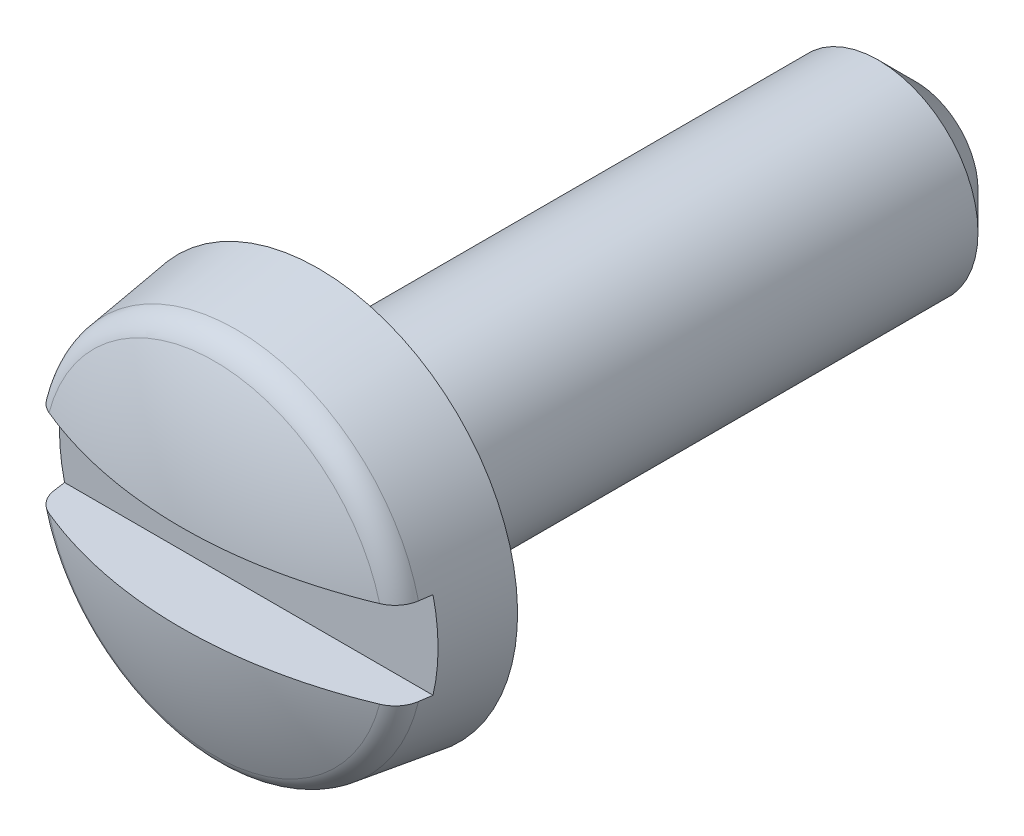
ISO-10303-21;
HEADER;
FILE_DESCRIPTION(('STEP AP214'),'2;1');
FILE_NAME('part.step','',(''),(''),'','','');
FILE_SCHEMA(('AUTOMOTIVE_DESIGN { 1 0 10303 214 1 1 1 1 }'));
ENDSEC;
DATA;
#1=APPLICATION_CONTEXT('core data for automotive mechanical design processes');
#2=APPLICATION_PROTOCOL_DEFINITION('international standard','automotive_design',2000,#1);
#3=PRODUCT_CONTEXT('',#1,'mechanical');
#4=PRODUCT('Part','Part','',(#3));
#5=PRODUCT_RELATED_PRODUCT_CATEGORY('part','',(#4));
#6=PRODUCT_DEFINITION_FORMATION('','',#4);
#7=PRODUCT_DEFINITION_CONTEXT('part definition',#1,'design');
#8=PRODUCT_DEFINITION('design','',#6,#7);
#9=PRODUCT_DEFINITION_SHAPE('','',#8);
#10=(LENGTH_UNIT() NAMED_UNIT(*) SI_UNIT(.MILLI.,.METRE.));
#11=(NAMED_UNIT(*) PLANE_ANGLE_UNIT() SI_UNIT($,.RADIAN.));
#12=(NAMED_UNIT(*) SI_UNIT($,.STERADIAN.) SOLID_ANGLE_UNIT());
#13=UNCERTAINTY_MEASURE_WITH_UNIT(LENGTH_MEASURE(1.E-05),#10,'distance_accuracy_value','');
#14=(GEOMETRIC_REPRESENTATION_CONTEXT(3) GLOBAL_UNCERTAINTY_ASSIGNED_CONTEXT((#13)) GLOBAL_UNIT_ASSIGNED_CONTEXT((#10,
#11,#12)) REPRESENTATION_CONTEXT('',''));
#15=CARTESIAN_POINT('',(0.,0.,0.));
#16=DIRECTION('',(0.,0.,1.));
#17=DIRECTION('',(1.,0.,0.));
#18=AXIS2_PLACEMENT_3D('',#15,#16,#17);
#19=CARTESIAN_POINT('',(0.,0.499999999999995,0.));
#20=DIRECTION('',(0.,0.,-1.));
#21=DIRECTION('',(-1.,0.,0.));
#22=AXIS2_PLACEMENT_3D('',#19,#20,#21);
#23=PLANE('',#22);
#24=CARTESIAN_POINT('',(0.,0.,0.));
#25=DIRECTION('',(0.,0.,1.));
#26=DIRECTION('',(1.,0.,0.));
#27=AXIS2_PLACEMENT_3D('',#24,#25,#26);
#28=CIRCLE('',#27,0.499999999999995);
#29=CARTESIAN_POINT('',(0.499999999999995,0.,0.));
#30=VERTEX_POINT('',#29);
#31=EDGE_CURVE('E58',#30,#30,#28,.T.);
#32=ORIENTED_EDGE('',*,*,#31,.T.);
#33=EDGE_LOOP('',(#32));
#34=FACE_BOUND('',#33,.T.);
#35=ADVANCED_FACE('F47',(#34),#23,.F.);
#36=CARTESIAN_POINT('',(0.,0.,-3.));
#37=DIRECTION('',(0.,0.,1.));
#38=DIRECTION('',(1.,0.,0.));
#39=AXIS2_PLACEMENT_3D('',#36,#37,#38);
#40=PLANE('',#39);
#41=CARTESIAN_POINT('',(0.,0.,-3.));
#42=DIRECTION('',(0.,0.,1.));
#43=DIRECTION('',(1.,0.,0.));
#44=AXIS2_PLACEMENT_3D('',#41,#42,#43);
#45=CIRCLE('',#44,0.3125);
#46=CARTESIAN_POINT('',(0.3125,0.,-3.));
#47=VERTEX_POINT('',#46);
#48=EDGE_CURVE('E11',#47,#47,#45,.F.);
#49=ORIENTED_EDGE('',*,*,#48,.T.);
#50=EDGE_LOOP('',(#49));
#51=FACE_BOUND('',#50,.T.);
#52=ADVANCED_FACE('F68',(#51),#40,.F.);
#53=CARTESIAN_POINT('',(0.,0.,0.));
#54=DIRECTION('',(0.,0.,1.));
#55=DIRECTION('',(1.,0.,0.));
#56=AXIS2_PLACEMENT_3D('',#53,#54,#55);
#57=CYLINDRICAL_SURFACE('',#56,0.499999999999998);
#58=CARTESIAN_POINT('',(0.,0.,-2.81250000000001));
#59=DIRECTION('',(0.,0.,1.));
#60=DIRECTION('',(1.,0.,0.));
#61=AXIS2_PLACEMENT_3D('',#58,#59,#60);
#62=CIRCLE('',#61,0.499999999999998);
#63=CARTESIAN_POINT('',(0.499999999999998,0.,-2.81250000000001));
#64=VERTEX_POINT('',#63);
#65=EDGE_CURVE('E54',#64,#64,#62,.T.);
#66=ORIENTED_EDGE('',*,*,#65,.T.);
#67=EDGE_LOOP('',(#66));
#68=FACE_BOUND('',#67,.T.);
#69=ORIENTED_EDGE('',*,*,#31,.F.);
#70=EDGE_LOOP('',(#69));
#71=FACE_BOUND('',#70,.T.);
#72=ADVANCED_FACE('F66',(#68,#71),#57,.T.);
#73=CARTESIAN_POINT('',(0.,0.,-2.81250000000001));
#74=DIRECTION('',(0.,0.,1.));
#75=DIRECTION('',(1.,0.,0.));
#76=AXIS2_PLACEMENT_3D('',#73,#74,#75);
#77=CONICAL_SURFACE('',#76,0.499999999999998,0.785398163397451);
#78=ORIENTED_EDGE('',*,*,#48,.F.);
#79=EDGE_LOOP('',(#78));
#80=FACE_BOUND('',#79,.T.);
#81=ORIENTED_EDGE('',*,*,#65,.F.);
#82=EDGE_LOOP('',(#81));
#83=FACE_BOUND('',#82,.T.);
#84=ADVANCED_FACE('F49',(#80,#83),#77,.T.);
#85=CLOSED_SHELL('',(#35,#52,#72,#84));
#86=MANIFOLD_SOLID_BREP('B2',#85);
#87=CARTESIAN_POINT('',(0.,0.,0.394275449645954));
#88=DIRECTION('',(0.,0.,-1.));
#89=DIRECTION('',(0.,1.,0.));
#90=AXIS2_PLACEMENT_3D('',#87,#88,#89);
#91=TOROIDAL_SURFACE('',#90,0.80321233905149,0.14);
#92=CARTESIAN_POINT('',(0.,0.,0.413759683780363));
#93=DIRECTION('',(0.,0.,-1.));
#94=DIRECTION('',(0.,1.,0.));
#95=AXIS2_PLACEMENT_3D('',#92,#93,#94);
#96=CIRCLE('',#95,0.94184986867531);
#97=CARTESIAN_POINT('',(-0.916094761814354,0.21875,0.413759683780363));
#98=VERTEX_POINT('',#97);
#99=CARTESIAN_POINT('',(0.916094761815194,0.21875,0.413759683780346));
#100=VERTEX_POINT('',#99);
#101=EDGE_CURVE('E246',#98,#100,#96,.T.);
#102=ORIENTED_EDGE('',*,*,#101,.F.);
#103=CARTESIAN_POINT('',(-0.908298096710703,0.21875,0.44351335950888));
#104=CARTESIAN_POINT('',(-0.90546587606768,0.21875,0.450841166861585));
#105=CARTESIAN_POINT('',(-0.902001299552201,0.21875,0.45793160829085));
#106=CARTESIAN_POINT('',(-0.893919277139418,0.21875,0.471430259415908));
#107=CARTESIAN_POINT('',(-0.889300176484245,0.21875,0.477837470882384));
#108=CARTESIAN_POINT('',(-0.879064397665562,0.21875,0.489780371236567));
#109=CARTESIAN_POINT('',(-0.873449303073414,0.21875,0.49531741765946));
#110=CARTESIAN_POINT('',(-0.861387637926678,0.21875,0.505390655225197));
#111=CARTESIAN_POINT('',(-0.854941264755969,0.21875,0.509927083270123));
#112=CARTESIAN_POINT('',(-0.841262540533524,0.21875,0.517977256867578));
#113=CARTESIAN_POINT('',(-0.834016917535255,0.21875,0.521468434465664));
#114=CARTESIAN_POINT('',(-0.819054565821893,0.21875,0.527226819730469));
#115=CARTESIAN_POINT('',(-0.811337745817561,0.21875,0.529493789377541));
#116=CARTESIAN_POINT('',(-0.795394171485356,0.21875,0.532812284257748));
#117=CARTESIAN_POINT('',(-0.787159014671234,0.21875,0.533823461115791));
#118=CARTESIAN_POINT('',(-0.770634038765989,0.21875,0.534485488838607));
#119=CARTESIAN_POINT('',(-0.762344211336497,0.21875,0.534136127168468));
#120=CARTESIAN_POINT('',(-0.745726678502417,0.21875,0.532068167841434));
#121=CARTESIAN_POINT('',(-0.737403173245442,0.21875,0.530315680080211));
#122=CARTESIAN_POINT('',(-0.721164351106892,0.21875,0.525446240757529));
#123=CARTESIAN_POINT('',(-0.713249072078477,0.21875,0.522329162916538));
#124=CARTESIAN_POINT('',(-0.698016836337013,0.21875,0.514786947648746));
#125=CARTESIAN_POINT('',(-0.690703115052091,0.21875,0.510355261357365));
#126=CARTESIAN_POINT('',(-0.67694748474871,0.21875,0.500297246389514));
#127=CARTESIAN_POINT('',(-0.670505500124136,0.21875,0.494671021424796));
#128=CARTESIAN_POINT('',(-0.658864272065659,0.21875,0.482524134982154));
#129=CARTESIAN_POINT('',(-0.65363772210281,0.21875,0.476029689412662));
#130=CARTESIAN_POINT('',(-0.644417255717111,0.21875,0.462217313185592));
#131=CARTESIAN_POINT('',(-0.640422923629696,0.21875,0.454899661359739));
#132=CARTESIAN_POINT('',(-0.633996231037358,0.21875,0.440040252283174));
#133=CARTESIAN_POINT('',(-0.631495850337233,0.21875,0.432527918400263));
#134=CARTESIAN_POINT('',(-0.627859818302351,0.21875,0.417180343631239));
#135=CARTESIAN_POINT('',(-0.626723721185648,0.21875,0.409345209086767));
#136=CARTESIAN_POINT('',(-0.625884470592882,0.21875,0.393957043514951));
#137=CARTESIAN_POINT('',(-0.626118551019446,0.21875,0.38640737129813));
#138=CARTESIAN_POINT('',(-0.627864338648409,0.21875,0.371457972824205));
#139=CARTESIAN_POINT('',(-0.629375941712668,0.21875,0.364058234395487));
#140=CARTESIAN_POINT('',(-0.633597394665731,0.21875,0.349684037827511));
#141=CARTESIAN_POINT('',(-0.636296159928562,0.21875,0.342706309290516));
#142=CARTESIAN_POINT('',(-0.642791432484734,0.21875,0.329282893249969));
#143=CARTESIAN_POINT('',(-0.646588078830291,0.21875,0.322837273273685));
#144=CARTESIAN_POINT('',(-0.655291816782195,0.21875,0.310435095359758));
#145=CARTESIAN_POINT('',(-0.660230522778939,0.21875,0.304500754381981));
#146=CARTESIAN_POINT('',(-0.670990197017428,0.21875,0.293495285966961));
#147=CARTESIAN_POINT('',(-0.676811369421504,0.21875,0.288424358862067));
#148=CARTESIAN_POINT('',(-0.689486484377738,0.21875,0.279019629085639));
#149=CARTESIAN_POINT('',(-0.696377810662117,0.21875,0.274736192554628));
#150=CARTESIAN_POINT('',(-0.710759980021573,0.21875,0.267333993767388));
#151=CARTESIAN_POINT('',(-0.718250955681383,0.21875,0.264215489950661));
#152=CARTESIAN_POINT('',(-0.733947701017012,0.21875,0.259110685806547));
#153=CARTESIAN_POINT('',(-0.74217014694009,0.21875,0.257175538134448));
#154=CARTESIAN_POINT('',(-0.758822442900704,0.21875,0.254692461016129));
#155=CARTESIAN_POINT('',(-0.767252315138808,0.21875,0.25414468071585));
#156=CARTESIAN_POINT('',(-0.784198496427754,0.21875,0.254460861713389));
#157=CARTESIAN_POINT('',(-0.792714469907884,0.21875,0.255343634011866));
#158=CARTESIAN_POINT('',(-0.80947236867788,0.21875,0.258546862669455));
#159=CARTESIAN_POINT('',(-0.817714305571943,0.21875,0.260867258069889));
#160=CARTESIAN_POINT('',(-0.833561974364109,0.21875,0.266855104435506));
#161=CARTESIAN_POINT('',(-0.84117501646527,0.21875,0.270503176447067));
#162=CARTESIAN_POINT('',(-0.855654587043211,0.21875,0.279063221945399));
#163=CARTESIAN_POINT('',(-0.862521230955438,0.21875,0.283974999594937));
#164=CARTESIAN_POINT('',(-0.875093907100177,0.21875,0.294768994115028));
#165=CARTESIAN_POINT('',(-0.880828252122069,0.21875,0.300618224337995));
#166=CARTESIAN_POINT('',(-0.891194637800137,0.21875,0.313223162868221));
#167=CARTESIAN_POINT('',(-0.895826926699477,0.21875,0.319978666496069));
#168=CARTESIAN_POINT('',(-0.903706726790305,0.21875,0.333975760345151));
#169=CARTESIAN_POINT('',(-0.90699304487449,0.21875,0.341195516463445));
#170=CARTESIAN_POINT('',(-0.912275923067008,0.21875,0.3560947863148));
#171=CARTESIAN_POINT('',(-0.914272322876699,0.21875,0.36377435705968));
#172=CARTESIAN_POINT('',(-0.916877951890813,0.21875,0.379190410472227));
#173=CARTESIAN_POINT('',(-0.917516698867591,0.21875,0.386921934406951));
#174=CARTESIAN_POINT('',(-0.917473240283907,0.21875,0.402374191729452));
#175=CARTESIAN_POINT('',(-0.916792836997114,0.21875,0.410094925437914));
#176=CARTESIAN_POINT('',(-0.914698323599504,0.21875,0.422104206193688));
#177=CARTESIAN_POINT('',(-0.913712595322454,0.21875,0.426471861950321));
#178=CARTESIAN_POINT('',(-0.911318973024326,0.21875,0.43508979325992));
#179=CARTESIAN_POINT('',(-0.909911085972691,0.21875,0.439340070749425));
#180=CARTESIAN_POINT('',(-0.908298096710703,0.21875,0.44351335950888));
#181=B_SPLINE_CURVE_WITH_KNOTS('',3,(#103,#104,#105,#106,#107,#108,#109,#110,#111,#112,#113,
#114,#115,#116,#117,#118,#119,#120,#121,#122,#123,#124,#125,#126,#127,#128,#129,#130,#131,#132,
#133,#134,#135,#136,#137,#138,#139,#140,#141,#142,#143,#144,#145,#146,#147,#148,#149,#150,#151,
#152,#153,#154,#155,#156,#157,#158,#159,#160,#161,#162,#163,#164,#165,#166,#167,#168,#169,#170,
#171,#172,#173,#174,#175,#176,#177,#178,#179,#180),.UNSPECIFIED.,.T.,.F.,(4,2,2,2,2,2,2,2,2,2,2,
2,2,2,2,2,2,2,2,2,2,2,2,2,2,2,2,2,2,2,2,2,2,2,2,2,2,2,4),(0.,0.0235514443772526,
0.0471368401352772,0.070685067257743,0.0942277132052808,0.118247066801327,0.142271088739532,
0.167048549799562,0.191829881596518,0.217228502026641,0.242629473348919,0.268159170417498,
0.293686651862812,0.318568604685774,0.343442154868012,0.367074007269188,0.390698135820095,
0.413248802724042,0.435797631572086,0.458140246931825,0.480485693337685,0.503545367481947,
0.526610384744117,0.550844045574451,0.575083079437009,0.60030700141774,0.625533634926786,
0.651094685021827,0.676654651340995,0.701855594770235,0.727052635143851,0.751504679454133,
0.775951210603895,0.799632530548676,0.823316792814487,0.846480615999438,0.869612814181612,
0.883025912523405,0.896438789439752),.UNSPECIFIED.);
#182=CARTESIAN_POINT('',(-0.830292301609561,0.21875,0.522842313289899));
#183=VERTEX_POINT('',#182);
#184=EDGE_CURVE('E125',#98,#183,#181,.T.);
#185=ORIENTED_EDGE('',*,*,#184,.T.);
#186=CARTESIAN_POINT('',(0.,0.,0.522842313289899));
#187=DIRECTION('',(0.,0.,-1.));
#188=DIRECTION('',(0.,1.,0.));
#189=AXIS2_PLACEMENT_3D('',#186,#187,#188);
#190=CIRCLE('',#189,0.858624987181309);
#191=CARTESIAN_POINT('',(0.830292301609561,0.21875,0.522842313289899));
#192=VERTEX_POINT('',#191);
#193=EDGE_CURVE('E239',#183,#192,#190,.T.);
#194=ORIENTED_EDGE('',*,*,#193,.T.);
#195=CARTESIAN_POINT('',(0.636199073908862,0.21875,0.445080766046602));
#196=CARTESIAN_POINT('',(0.639221871795937,0.21875,0.452419679929767));
#197=CARTESIAN_POINT('',(0.642892347614786,0.21875,0.459499901181548));
#198=CARTESIAN_POINT('',(0.651388492840425,0.21875,0.472939263013923));
#199=CARTESIAN_POINT('',(0.656216227293553,0.21875,0.479297084284743));
#200=CARTESIAN_POINT('',(0.666843908403433,0.21875,0.491108278478201));
#201=CARTESIAN_POINT('',(0.67264123310137,0.21875,0.496564013744487));
#202=CARTESIAN_POINT('',(0.685037136896968,0.21875,0.506465769629722));
#203=CARTESIAN_POINT('',(0.691635507507495,0.21875,0.51091205211659));
#204=CARTESIAN_POINT('',(0.705714137946757,0.21875,0.518850306793893));
#205=CARTESIAN_POINT('',(0.713218280935174,0.21875,0.522299934572982));
#206=CARTESIAN_POINT('',(0.728687966841779,0.21875,0.527934876175005));
#207=CARTESIAN_POINT('',(0.736653619555112,0.21875,0.530119887770311));
#208=CARTESIAN_POINT('',(0.75308833840897,0.21875,0.533219794068409));
#209=CARTESIAN_POINT('',(0.761565357780612,0.21875,0.534092707569844));
#210=CARTESIAN_POINT('',(0.778546536116988,0.21875,0.534406541532534));
#211=CARTESIAN_POINT('',(0.787050696405592,0.21875,0.533847391040973));
#212=CARTESIAN_POINT('',(0.80385821076013,0.21875,0.531296892356703));
#213=CARTESIAN_POINT('',(0.812161176353895,0.21875,0.529302971310982));
#214=CARTESIAN_POINT('',(0.828301909631297,0.21875,0.523918517848576));
#215=CARTESIAN_POINT('',(0.836139723929286,0.21875,0.520528125648192));
#216=CARTESIAN_POINT('',(0.850940981752024,0.21875,0.512519516730979));
#217=CARTESIAN_POINT('',(0.857919751034182,0.21875,0.507929650258378));
#218=CARTESIAN_POINT('',(0.870974663558249,0.21875,0.497607541511526));
#219=CARTESIAN_POINT('',(0.877050964690619,0.21875,0.491875499477403));
#220=CARTESIAN_POINT('',(0.887922289660093,0.21875,0.479627288270756));
#221=CARTESIAN_POINT('',(0.892751856699979,0.21875,0.47314177793073));
#222=CARTESIAN_POINT('',(0.901215369996219,0.21875,0.459432460159061));
#223=CARTESIAN_POINT('',(0.904849525889024,0.21875,0.452208782469629));
#224=CARTESIAN_POINT('',(0.910712880879384,0.21875,0.437452906652586));
#225=CARTESIAN_POINT('',(0.912979482735655,0.21875,0.429935557848827));
#226=CARTESIAN_POINT('',(0.916193429341789,0.21875,0.414624075869922));
#227=CARTESIAN_POINT('',(0.917140928582312,0.21875,0.406829975217068));
#228=CARTESIAN_POINT('',(0.91768046566402,0.21875,0.391331197734639));
#229=CARTESIAN_POINT('',(0.917295774110684,0.21875,0.383627320887321));
#230=CARTESIAN_POINT('',(0.91523500139674,0.21875,0.368394630961381));
#231=CARTESIAN_POINT('',(0.913558969146591,0.21875,0.360865811263469));
#232=CARTESIAN_POINT('',(0.908974793271683,0.21875,0.346212398301789));
#233=CARTESIAN_POINT('',(0.906069436515574,0.21875,0.339086931811113));
#234=CARTESIAN_POINT('',(0.899118375707791,0.21875,0.325416382150965));
#235=CARTESIAN_POINT('',(0.895072624857743,0.21875,0.318871322814165));
#236=CARTESIAN_POINT('',(0.885904924032678,0.21875,0.306453284463434));
#237=CARTESIAN_POINT('',(0.880769757256492,0.21875,0.300590070581122));
#238=CARTESIAN_POINT('',(0.869609619114896,0.21875,0.28978329382011));
#239=CARTESIAN_POINT('',(0.863584553378945,0.21875,0.284839828603195));
#240=CARTESIAN_POINT('',(0.850656599848986,0.21875,0.275878063105083));
#241=CARTESIAN_POINT('',(0.843735499600112,0.21875,0.271886047891587));
#242=CARTESIAN_POINT('',(0.829336696640311,0.21875,0.265080536665935));
#243=CARTESIAN_POINT('',(0.821858910478158,0.21875,0.2622672177695));
#244=CARTESIAN_POINT('',(0.806310943782284,0.21875,0.25780696822477));
#245=CARTESIAN_POINT('',(0.79822957111341,0.21875,0.256199046605818));
#246=CARTESIAN_POINT('',(0.781912766905967,0.21875,0.254322991830654));
#247=CARTESIAN_POINT('',(0.773677311046941,0.21875,0.2540550720016));
#248=CARTESIAN_POINT('',(0.757045728719667,0.21875,0.254866652078537));
#249=CARTESIAN_POINT('',(0.748651403084997,0.21875,0.255983367650265));
#250=CARTESIAN_POINT('',(0.73216351662249,0.21875,0.259593914337957));
#251=CARTESIAN_POINT('',(0.724069991873237,0.21875,0.262087910082034));
#252=CARTESIAN_POINT('',(0.708326995062809,0.21875,0.268425281489904));
#253=CARTESIAN_POINT('',(0.700683238129878,0.21875,0.272282887884633));
#254=CARTESIAN_POINT('',(0.686166569504614,0.21875,0.281248794705725));
#255=CARTESIAN_POINT('',(0.679293632860175,0.21875,0.286357054630326));
#256=CARTESIAN_POINT('',(0.666659895223772,0.21875,0.297594263117412));
#257=CARTESIAN_POINT('',(0.660881252993155,0.21875,0.303703115024868));
#258=CARTESIAN_POINT('',(0.650491528686382,0.21875,0.316844489561124));
#259=CARTESIAN_POINT('',(0.645880057495703,0.21875,0.323876703166595));
#260=CARTESIAN_POINT('',(0.638190423680534,0.21875,0.338319074595225));
#261=CARTESIAN_POINT('',(0.635051198169218,0.21875,0.345696699382189));
#262=CARTESIAN_POINT('',(0.630129278389261,0.21875,0.360893620428927));
#263=CARTESIAN_POINT('',(0.62834647349534,0.21875,0.368712880614459));
#264=CARTESIAN_POINT('',(0.626268171710834,0.21875,0.384152879780144));
#265=CARTESIAN_POINT('',(0.625903794770541,0.21875,0.391764449673391));
#266=CARTESIAN_POINT('',(0.626487419786618,0.21875,0.406929627835407));
#267=CARTESIAN_POINT('',(0.627433479350467,0.21875,0.414483305238499));
#268=CARTESIAN_POINT('',(0.629856297227012,0.21875,0.42585852409179));
#269=CARTESIAN_POINT('',(0.630881491957186,0.21875,0.429781684962614));
#270=CARTESIAN_POINT('',(0.63328121972972,0.21875,0.437519292880843));
#271=CARTESIAN_POINT('',(0.634655728401496,0.21875,0.44133374749172));
#272=CARTESIAN_POINT('',(0.636199073908862,0.21875,0.445080766046602));
#273=B_SPLINE_CURVE_WITH_KNOTS('',3,(#195,#196,#197,#198,#199,#200,#201,#202,#203,#204,#205,
#206,#207,#208,#209,#210,#211,#212,#213,#214,#215,#216,#217,#218,#219,#220,#221,#222,#223,#224,
#225,#226,#227,#228,#229,#230,#231,#232,#233,#234,#235,#236,#237,#238,#239,#240,#241,#242,#243,
#244,#245,#246,#247,#248,#249,#250,#251,#252,#253,#254,#255,#256,#257,#258,#259,#260,#261,#262,
#263,#264,#265,#266,#267,#268,#269,#270,#271,#272),.UNSPECIFIED.,.T.,.F.,(4,2,2,2,2,2,2,2,2,2,2,
2,2,2,2,2,2,2,2,2,2,2,2,2,2,2,2,2,2,2,2,2,2,2,2,2,2,2,4),(0.,0.0237954619668287,
0.0476337055528994,0.0714084984369589,0.0951771167007518,0.119842686456995,0.144514148547847,
0.169959333758076,0.195405779695815,0.220897970677846,0.246387602674184,0.271322071758045,
0.296252173303728,0.320391079863077,0.34452575097927,0.367966265600052,0.391404034683634,
0.414434474973856,0.437464043012463,0.460441680585763,0.48342026123015,0.506695433114463,
0.529973075020455,0.553833973670095,0.577698456470977,0.602305361029847,0.626916182862536,
0.652203061677641,0.677492963721127,0.703054988074288,0.728616184724073,0.753715812128033,
0.778807060698011,0.802737576234786,0.826666139866831,0.849417052910517,0.872134279510469,
0.884284341253345,0.89643355555551),.UNSPECIFIED.);
#274=EDGE_CURVE('E173',#192,#100,#273,.T.);
#275=ORIENTED_EDGE('',*,*,#274,.T.);
#276=EDGE_LOOP('',(#102,#185,#194,#275));
#277=FACE_BOUND('',#276,.T.);
#278=ADVANCED_FACE('F102',(#277),#91,.T.);
#279=CARTESIAN_POINT('',(0.,0.,-1.46931517013524));
#280=DIRECTION('',(0.,0.,-1.));
#281=DIRECTION('',(0.,1.,0.));
#282=AXIS2_PLACEMENT_3D('',#279,#280,#281);
#283=SPHERICAL_SURFACE('',#282,2.16931517013524);
#284=ORIENTED_EDGE('',*,*,#193,.F.);
#285=CARTESIAN_POINT('',(0.,0.21875,-1.46931517013524));
#286=DIRECTION('',(0.,1.,0.));
#287=DIRECTION('',(-1.,0.,0.));
#288=AXIS2_PLACEMENT_3D('',#285,#286,#287);
#289=CIRCLE('',#288,2.15825780315487);
#290=EDGE_CURVE('E250',#183,#192,#289,.T.);
#291=ORIENTED_EDGE('',*,*,#290,.T.);
#292=EDGE_LOOP('',(#284,#291));
#293=FACE_BOUND('',#292,.T.);
#294=ADVANCED_FACE('F217',(#293),#283,.T.);
#295=CARTESIAN_POINT('',(0.830292301609561,-0.21875,0.522842313289899));
#296=VERTEX_POINT('',#295);
#297=CARTESIAN_POINT('',(-0.830292301609561,-0.21875,0.522842313289899));
#298=VERTEX_POINT('',#297);
#299=EDGE_CURVE('E242',#296,#298,#190,.T.);
#300=ORIENTED_EDGE('',*,*,#299,.T.);
#301=CARTESIAN_POINT('',(-0.908298096710703,-0.21875,0.44351335950888));
#302=CARTESIAN_POINT('',(-0.911061875153635,-0.21875,0.436360609993783));
#303=CARTESIAN_POINT('',(-0.913227397599329,-0.21875,0.428971186973506));
#304=CARTESIAN_POINT('',(-0.916288677967043,-0.21875,0.413928066335769));
#305=CARTESIAN_POINT('',(-0.917183123321222,-0.21875,0.406274103883314));
#306=CARTESIAN_POINT('',(-0.917670460099421,-0.21875,0.390926321559672));
#307=CARTESIAN_POINT('',(-0.91726371622154,-0.21875,0.383232513459936));
#308=CARTESIAN_POINT('',(-0.915162519768296,-0.21875,0.368024837159456));
#309=CARTESIAN_POINT('',(-0.913468336938617,-0.21875,0.360510931605455));
#310=CARTESIAN_POINT('',(-0.908849214426148,-0.21875,0.345879188048193));
#311=CARTESIAN_POINT('',(-0.905925352148223,-0.21875,0.338761009488358));
#312=CARTESIAN_POINT('',(-0.898938781534969,-0.21875,0.325107762801565));
#313=CARTESIAN_POINT('',(-0.894875994481106,-0.21875,0.318572735021141));
#314=CARTESIAN_POINT('',(-0.885675596544133,-0.21875,0.306176860994936));
#315=CARTESIAN_POINT('',(-0.88052469913653,-0.21875,0.300325883899576));
#316=CARTESIAN_POINT('',(-0.869335379437766,-0.21875,0.289545915119964));
#317=CARTESIAN_POINT('',(-0.863296862914852,-0.21875,0.284617021452697));
#318=CARTESIAN_POINT('',(-0.85034380025921,-0.21875,0.275686327269938));
#319=CARTESIAN_POINT('',(-0.843411051589064,-0.21875,0.271710940031769));
#320=CARTESIAN_POINT('',(-0.828991832153831,-0.21875,0.264940344120792));
#321=CARTESIAN_POINT('',(-0.821505279478692,-0.21875,0.262145310439266));
#322=CARTESIAN_POINT('',(-0.805942485496776,-0.21875,0.25772336523243));
#323=CARTESIAN_POINT('',(-0.797855142978704,-0.21875,0.256135517803885));
#324=CARTESIAN_POINT('',(-0.78152972799771,-0.21875,0.25430041311885));
#325=CARTESIAN_POINT('',(-0.77329163142873,-0.21875,0.254053372174647));
#326=CARTESIAN_POINT('',(-0.756658799095929,-0.21875,0.254907615552781));
#327=CARTESIAN_POINT('',(-0.74826595458559,-0.21875,0.256046021758794));
#328=CARTESIAN_POINT('',(-0.731784704850856,-0.21875,0.259699658329189));
#329=CARTESIAN_POINT('',(-0.723696335086306,-0.21875,0.262215048533407));
#330=CARTESIAN_POINT('',(-0.707968839059437,-0.21875,0.268594101599945));
#331=CARTESIAN_POINT('',(-0.700335370258138,-0.21875,0.272471745706459));
#332=CARTESIAN_POINT('',(-0.685842794888433,-0.21875,0.281475988247771));
#333=CARTESIAN_POINT('',(-0.678983661213963,-0.21875,0.286602542943858));
#334=CARTESIAN_POINT('',(-0.666382350158108,-0.21875,0.297872210824304));
#335=CARTESIAN_POINT('',(-0.66062200817561,-0.21875,0.303994974448222));
#336=CARTESIAN_POINT('',(-0.6502710252107,-0.21875,0.317161105433091));
#337=CARTESIAN_POINT('',(-0.645680041514978,-0.21875,0.324204202146853));
#338=CARTESIAN_POINT('',(-0.638032450953357,-0.21875,0.338663907385139));
#339=CARTESIAN_POINT('',(-0.634914644537367,-0.21875,0.346048124514128));
#340=CARTESIAN_POINT('',(-0.630037020159066,-0.21875,0.361251950139768));
#341=CARTESIAN_POINT('',(-0.628276714008237,-0.21875,0.369071401030611));
#342=CARTESIAN_POINT('',(-0.626242110416401,-0.21875,0.38450561650333));
#343=CARTESIAN_POINT('',(-0.625898430999045,-0.21875,0.392111293560934));
#344=CARTESIAN_POINT('',(-0.626519996074544,-0.21875,0.407268274776208));
#345=CARTESIAN_POINT('',(-0.627485059437091,-0.21875,0.41481958631268));
#346=CARTESIAN_POINT('',(-0.630654231385851,-0.21875,0.429508022045917));
#347=CARTESIAN_POINT('',(-0.63283482404183,-0.21875,0.436650251786366));
#348=CARTESIAN_POINT('',(-0.63833635294526,-0.21875,0.450480224955342));
#349=CARTESIAN_POINT('',(-0.64165739169559,-0.21875,0.457167927466382));
#350=CARTESIAN_POINT('',(-0.649419341364567,-0.21875,0.470079180600471));
#351=CARTESIAN_POINT('',(-0.653885417162481,-0.21875,0.476287574845552));
#352=CARTESIAN_POINT('',(-0.663750955318374,-0.21875,0.487911416115113));
#353=CARTESIAN_POINT('',(-0.669150620259375,-0.21875,0.493326690565478));
#354=CARTESIAN_POINT('',(-0.681012709994888,-0.21875,0.503492991051899));
#355=CARTESIAN_POINT('',(-0.687514323781215,-0.21875,0.508198290993338));
#356=CARTESIAN_POINT('',(-0.701187446475499,-0.21875,0.516506326553253));
#357=CARTESIAN_POINT('',(-0.7083591128359,-0.21875,0.520108802169523));
#358=CARTESIAN_POINT('',(-0.723515646088744,-0.21875,0.526269046524545));
#359=CARTESIAN_POINT('',(-0.73152256650329,-0.21875,0.528772653630565));
#360=CARTESIAN_POINT('',(-0.74783946834169,-0.21875,0.532429962068277));
#361=CARTESIAN_POINT('',(-0.756149492242674,-0.21875,0.533583473441311));
#362=CARTESIAN_POINT('',(-0.773012897623027,-0.21875,0.534515214075671));
#363=CARTESIAN_POINT('',(-0.781567835621586,-0.21875,0.534265692887914));
#364=CARTESIAN_POINT('',(-0.798512252441032,-0.21875,0.532321217111357));
#365=CARTESIAN_POINT('',(-0.806901739494396,-0.21875,0.530626334627187));
#366=CARTESIAN_POINT('',(-0.82319333988416,-0.21875,0.52584358101539));
#367=CARTESIAN_POINT('',(-0.831099134984721,-0.21875,0.522768278260817));
#368=CARTESIAN_POINT('',(-0.846263050976966,-0.21875,0.515296442855156));
#369=CARTESIAN_POINT('',(-0.853521095812876,-0.21875,0.510899755317327));
#370=CARTESIAN_POINT('',(-0.866968072449845,-0.21875,0.50103484388543));
#371=CARTESIAN_POINT('',(-0.873180536296542,-0.21875,0.495598673824342));
#372=CARTESIAN_POINT('',(-0.884560617606425,-0.21875,0.483733607458869));
#373=CARTESIAN_POINT('',(-0.889729731191962,-0.21875,0.477306156298616));
#374=CARTESIAN_POINT('',(-0.897110269747027,-0.21875,0.466258611377408));
#375=CARTESIAN_POINT('',(-0.899697587033121,-0.21875,0.461884920434486));
#376=CARTESIAN_POINT('',(-0.904376688423814,-0.21875,0.452879842651308));
#377=CARTESIAN_POINT('',(-0.906468482585554,-0.21875,0.4482484610435));
#378=CARTESIAN_POINT('',(-0.908298096710703,-0.21875,0.44351335950888));
#379=B_SPLINE_CURVE_WITH_KNOTS('',3,(#301,#302,#303,#304,#305,#306,#307,#308,#309,#310,#311,
#312,#313,#314,#315,#316,#317,#318,#319,#320,#321,#322,#323,#324,#325,#326,#327,#328,#329,#330,
#331,#332,#333,#334,#335,#336,#337,#338,#339,#340,#341,#342,#343,#344,#345,#346,#347,#348,#349,
#350,#351,#352,#353,#354,#355,#356,#357,#358,#359,#360,#361,#362,#363,#364,#365,#366,#367,#368,
#369,#370,#371,#372,#373,#374,#375,#376,#377,#378),.UNSPECIFIED.,.T.,.F.,(4,2,2,2,2,2,2,2,2,2,2,
2,2,2,2,2,2,2,2,2,2,2,2,2,2,2,2,2,2,2,2,2,2,2,2,2,2,2,4),(0.,0.0229860350122594,
0.0459957891686979,0.0689990947025291,0.0919975818858424,0.114975960389838,0.137955927471462,
0.161234644219291,0.184515834078204,0.20838213467001,0.232251972278029,0.256864733008175,
0.281481464396597,0.306772555094134,0.332066582195645,0.357628182666193,0.383188888060026,
0.408281202011227,0.433366153470716,0.457289681883229,0.481204602823893,0.503933223705808,
0.526658699262257,0.548959060298464,0.571261426207827,0.594103716464941,0.616950969591684,
0.640921098088115,0.664896873445019,0.689949015091138,0.71500468115351,0.740557642059041,
0.766109328280508,0.791432948781844,0.816759538761749,0.841403913878119,0.866012694885098,
0.881229699018695,0.896446394281353),.UNSPECIFIED.);
#380=CARTESIAN_POINT('',(-0.916094761815463,-0.21875,0.413759683780339));
#381=VERTEX_POINT('',#380);
#382=EDGE_CURVE('E117',#298,#381,#379,.T.);
#383=ORIENTED_EDGE('',*,*,#382,.T.);
#384=CARTESIAN_POINT('',(0.916094761814354,-0.21875,0.413759683780363));
#385=VERTEX_POINT('',#384);
#386=EDGE_CURVE('E172',#385,#381,#96,.T.);
#387=ORIENTED_EDGE('',*,*,#386,.F.);
#388=CARTESIAN_POINT('',(0.636199073908862,-0.21875,0.445080766046602));
#389=CARTESIAN_POINT('',(0.633350641076088,-0.21875,0.438163299152584));
#390=CARTESIAN_POINT('',(0.63107323470222,-0.21875,0.431006156847653));
#391=CARTESIAN_POINT('',(0.627749305178523,-0.21875,0.416407007606685));
#392=CARTESIAN_POINT('',(0.62670364614607,-0.21875,0.40896480446436));
#393=CARTESIAN_POINT('',(0.625886618312126,-0.21875,0.394008718647454));
#394=CARTESIAN_POINT('',(0.626115477736154,-0.21875,0.3864948233756));
#395=CARTESIAN_POINT('',(0.627838945223783,-0.21875,0.371615286550474));
#396=CARTESIAN_POINT('',(0.629333388937493,-0.21875,0.364249625874469));
#397=CARTESIAN_POINT('',(0.633519758305495,-0.21875,0.349903501580754));
#398=CARTESIAN_POINT('',(0.63620637214333,-0.21875,0.342921482000943));
#399=CARTESIAN_POINT('',(0.642678461837383,-0.21875,0.329487647117732));
#400=CARTESIAN_POINT('',(0.646464095339662,-0.21875,0.32303590804954));
#401=CARTESIAN_POINT('',(0.655145937783406,-0.21875,0.310620986782075));
#402=CARTESIAN_POINT('',(0.660073602275078,-0.21875,0.304679831308973));
#403=CARTESIAN_POINT('',(0.670812434822492,-0.21875,0.293659093088525));
#404=CARTESIAN_POINT('',(0.676623806629758,-0.21875,0.288579709608086));
#405=CARTESIAN_POINT('',(0.689280170242843,-0.21875,0.279156233491859));
#406=CARTESIAN_POINT('',(0.696162606214774,-0.21875,0.274862413925538));
#407=CARTESIAN_POINT('',(0.710528712044075,-0.21875,0.267438025708824));
#408=CARTESIAN_POINT('',(0.718012514218727,-0.21875,0.264307713919521));
#409=CARTESIAN_POINT('',(0.733697428120707,-0.21875,0.259177274948705));
#410=CARTESIAN_POINT('',(0.741915342198417,-0.21875,0.257228391936699));
#411=CARTESIAN_POINT('',(0.758560907635094,-0.21875,0.25471705037538));
#412=CARTESIAN_POINT('',(0.766988581981028,-0.21875,0.254154744458409));
#413=CARTESIAN_POINT('',(0.783934148237295,-0.21875,0.254441214591109));
#414=CARTESIAN_POINT('',(0.792451734074862,-0.21875,0.255309018123292));
#415=CARTESIAN_POINT('',(0.809215411680191,-0.21875,0.25848261999177));
#416=CARTESIAN_POINT('',(0.817461515437596,-0.21875,0.260788354733821));
#417=CARTESIAN_POINT('',(0.833320964160535,-0.21875,0.266748166096314));
#418=CARTESIAN_POINT('',(0.840941522355484,-0.21875,0.270383016354648));
#419=CARTESIAN_POINT('',(0.855438336111518,-0.21875,0.278918056788882));
#420=CARTESIAN_POINT('',(0.862314707361049,-0.21875,0.283818049888388));
#421=CARTESIAN_POINT('',(0.87490864049596,-0.21875,0.294590784224632));
#422=CARTESIAN_POINT('',(0.88065443562819,-0.21875,0.300430510632151));
#423=CARTESIAN_POINT('',(0.891045415620485,-0.21875,0.313018818697569));
#424=CARTESIAN_POINT('',(0.895690803094465,-0.21875,0.319767232682782));
#425=CARTESIAN_POINT('',(0.903597651106758,-0.21875,0.333753479325137));
#426=CARTESIAN_POINT('',(0.906897783555956,-0.21875,0.340969460127889));
#427=CARTESIAN_POINT('',(0.912207830469186,-0.21875,0.355861448181395));
#428=CARTESIAN_POINT('',(0.914217930893596,-0.21875,0.363537388953614));
#429=CARTESIAN_POINT('',(0.916850083189097,-0.21875,0.378945093813331));
#430=CARTESIAN_POINT('',(0.917502400163747,-0.21875,0.386671699954827));
#431=CARTESIAN_POINT('',(0.917488448384353,-0.21875,0.402123445638494));
#432=CARTESIAN_POINT('',(0.916822272074418,-0.21875,0.409848585245509));
#433=CARTESIAN_POINT('',(0.914204455510127,-0.21875,0.425010535912023));
#434=CARTESIAN_POINT('',(0.91226364689148,-0.21875,0.432449222222477));
#435=CARTESIAN_POINT('',(0.907169283736366,-0.21875,0.446898548232551));
#436=CARTESIAN_POINT('',(0.904015715264681,-0.21875,0.453909183012572));
#437=CARTESIAN_POINT('',(0.896567505731639,-0.21875,0.467360570412251));
#438=CARTESIAN_POINT('',(0.892264874243288,-0.21875,0.473796894267568));
#439=CARTESIAN_POINT('',(0.88266064195338,-0.21875,0.485874466651741));
#440=CARTESIAN_POINT('',(0.877358959598115,-0.21875,0.491515650206589));
#441=CARTESIAN_POINT('',(0.865792453580436,-0.21875,0.501971666873758));
#442=CARTESIAN_POINT('',(0.859509869956819,-0.21875,0.506766842220583));
#443=CARTESIAN_POINT('',(0.846248096819184,-0.21875,0.515269907890456));
#444=CARTESIAN_POINT('',(0.83926881137995,-0.21875,0.518977648212755));
#445=CARTESIAN_POINT('',(0.824591464486198,-0.21875,0.525318492765994));
#446=CARTESIAN_POINT('',(0.816878220039073,-0.21875,0.527916445036938));
#447=CARTESIAN_POINT('',(0.801132007436654,-0.21875,0.531822916395084));
#448=CARTESIAN_POINT('',(0.793098987668387,-0.21875,0.53313122644393));
#449=CARTESIAN_POINT('',(0.776681594106376,-0.21875,0.534458485564936));
#450=CARTESIAN_POINT('',(0.768293952279938,-0.21875,0.534437135989884));
#451=CARTESIAN_POINT('',(0.751636302834019,-0.21875,0.533014933908538));
#452=CARTESIAN_POINT('',(0.743366307859902,-0.21875,0.531613934229142));
#453=CARTESIAN_POINT('',(0.727015281359159,-0.21875,0.527431946704688));
#454=CARTESIAN_POINT('',(0.718940775710706,-0.21875,0.524625376623971));
#455=CARTESIAN_POINT('',(0.703377884584961,-0.21875,0.51768858752399));
#456=CARTESIAN_POINT('',(0.695889670456992,-0.21875,0.513557983326507));
#457=CARTESIAN_POINT('',(0.6817686727991,-0.21875,0.504099272161266));
#458=CARTESIAN_POINT('',(0.675131588173332,-0.21875,0.498777592263949));
#459=CARTESIAN_POINT('',(0.662893622961819,-0.21875,0.487060904420149));
#460=CARTESIAN_POINT('',(0.65729127002405,-0.21875,0.48066744665887));
#461=CARTESIAN_POINT('',(0.649067184020895,-0.21875,0.469377280750119));
#462=CARTESIAN_POINT('',(0.646087665346826,-0.21875,0.464737186965091));
#463=CARTESIAN_POINT('',(0.640702008025479,-0.21875,0.455134927310416));
#464=CARTESIAN_POINT('',(0.638295833415951,-0.21875,0.450172781665901));
#465=CARTESIAN_POINT('',(0.636199073908862,-0.21875,0.445080766046602));
#466=B_SPLINE_CURVE_WITH_KNOTS('',3,(#388,#389,#390,#391,#392,#393,#394,#395,#396,#397,#398,
#399,#400,#401,#402,#403,#404,#405,#406,#407,#408,#409,#410,#411,#412,#413,#414,#415,#416,#417,
#418,#419,#420,#421,#422,#423,#424,#425,#426,#427,#428,#429,#430,#431,#432,#433,#434,#435,#436,
#437,#438,#439,#440,#441,#442,#443,#444,#445,#446,#447,#448,#449,#450,#451,#452,#453,#454,#455,
#456,#457,#458,#459,#460,#461,#462,#463,#464,#465),.UNSPECIFIED.,.T.,.F.,(4,2,2,2,2,2,2,2,2,2,2,
2,2,2,2,2,2,2,2,2,2,2,2,2,2,2,2,2,2,2,2,2,2,2,2,2,2,2,4),(0.,0.0224234868977372,
0.0448626953692677,0.0673059221150167,0.0897462348104033,0.112087551306165,0.134432074079639,
0.157486316258256,0.18054588200852,0.204773411507921,0.22900628641093,0.254226494724664,
0.279449479117483,0.305010770140366,0.330570930764459,0.355775100892381,0.380975347231484,
0.405431097269444,0.429882340856092,0.453570361523423,0.477254966753588,0.50040572602198,
0.523554862168335,0.546509782424338,0.569464966451734,0.592584132936148,0.615705187483748,
0.639307793446952,0.662913653623151,0.687219964405201,0.711530214354318,0.736577595305214,
0.761627648455444,0.787151164796057,0.812682112998456,0.838078481999093,0.863438430518303,
0.879945616088416,0.896451765994412),.UNSPECIFIED.);
#467=EDGE_CURVE('E205',#385,#296,#466,.T.);
#468=ORIENTED_EDGE('',*,*,#467,.T.);
#469=EDGE_LOOP('',(#300,#383,#387,#468));
#470=FACE_BOUND('',#469,.T.);
#471=ADVANCED_FACE('F214',(#470),#91,.T.);
#472=CARTESIAN_POINT('',(0.,0.,0.413759683780363));
#473=DIRECTION('',(0.,0.,-1.));
#474=DIRECTION('',(0.,1.,0.));
#475=AXIS2_PLACEMENT_3D('',#472,#473,#474);
#476=CONICAL_SURFACE('',#475,0.94184986867531,0.139626340159546);
#477=CARTESIAN_POINT('',(0.,0.,0.35));
#478=DIRECTION('',(0.,0.,1.));
#479=DIRECTION('',(1.,0.,0.));
#480=AXIS2_PLACEMENT_3D('',#477,#478,#479);
#481=CIRCLE('',#480,0.950810707854163);
#482=CARTESIAN_POINT('',(-0.925305052223392,0.21875,0.35));
#483=VERTEX_POINT('',#482);
#484=CARTESIAN_POINT('',(-0.925305052223392,-0.21875,0.35));
#485=VERTEX_POINT('',#484);
#486=EDGE_CURVE('E45',#483,#485,#481,.T.);
#487=ORIENTED_EDGE('',*,*,#486,.F.);
#488=CARTESIAN_POINT('',(-1.15260409792562,0.21875,-1.23222898327176));
#489=CARTESIAN_POINT('',(-1.11353077067553,0.21875,-0.959109896112003));
#490=CARTESIAN_POINT('',(-1.07439728134131,0.21875,-0.685999388381822));
#491=CARTESIAN_POINT('',(-0.995941090117861,0.21875,-0.139805873733739));
#492=CARTESIAN_POINT('',(-0.956618388441736,0.21875,0.133277133214783));
#493=CARTESIAN_POINT('',(-0.87771476546612,0.21875,0.679406134014161));
#494=CARTESIAN_POINT('',(-0.838133843963776,0.21875,0.95245212783577));
#495=CARTESIAN_POINT('',(-0.75855579066236,0.21875,1.49848374095138));
#496=CARTESIAN_POINT('',(-0.718558658378914,0.21875,1.77146936017474));
#497=CARTESIAN_POINT('',(-0.678274455865409,0.21875,2.04441290084377));
#498=B_SPLINE_CURVE_WITH_KNOTS('',3,(#488,#489,#490,#491,#492,#493,#494,#495,#496,#497),
.UNSPECIFIED.,.F.,.F.,(4,2,2,2,4),(0.,0.827699756662302,1.65539858130511,2.48309805624709,
3.31079849454763),.UNSPECIFIED.);
#499=EDGE_CURVE('E233',#483,#98,#498,.T.);
#500=ORIENTED_EDGE('',*,*,#499,.T.);
#501=ORIENTED_EDGE('',*,*,#101,.T.);
#502=CARTESIAN_POINT('',(0.678274455865409,0.21875,2.04441290084377));
#503=CARTESIAN_POINT('',(0.708730218380393,0.21875,1.83811223674538));
#504=CARTESIAN_POINT('',(0.739013949302731,0.21875,1.63178629512625));
#505=CARTESIAN_POINT('',(0.799317931131074,0.21875,1.21909602410894));
#506=CARTESIAN_POINT('',(0.829338182200241,0.21875,1.01273169473461));
#507=CARTESIAN_POINT('',(0.878602823690834,0.21875,0.673021796643266));
#508=CARTESIAN_POINT('',(0.897900481602904,0.21875,0.539683940488922));
#509=CARTESIAN_POINT('',(0.956620552363311,0.21875,0.133277268420003));
#510=CARTESIAN_POINT('',(0.995942214657721,0.21875,-0.13980610415774));
#511=CARTESIAN_POINT('',(1.07439627010251,0.21875,-0.685999952730317));
#512=CARTESIAN_POINT('',(1.11352866331513,0.21875,-0.95911042871621));
#513=CARTESIAN_POINT('',(1.15260409792562,0.21875,-1.23222898327176));
#514=B_SPLINE_CURVE_WITH_KNOTS('',3,(#502,#503,#504,#505,#506,#507,#508,#509,#510,#511,#512,
#513),.UNSPECIFIED.,.F.,.F.,(4,2,2,2,2,4),(0.,0.625609590048399,1.25121879265211,
1.65539999376115,2.48309942050928,3.31079857506595),.UNSPECIFIED.);
#515=CARTESIAN_POINT('',(0.925305052223392,0.21875,0.35));
#516=VERTEX_POINT('',#515);
#517=EDGE_CURVE('E226',#100,#516,#514,.T.);
#518=ORIENTED_EDGE('',*,*,#517,.T.);
#519=CARTESIAN_POINT('',(0.925305052223392,-0.21875,0.35));
#520=VERTEX_POINT('',#519);
#521=EDGE_CURVE('E106',#520,#516,#481,.T.);
#522=ORIENTED_EDGE('',*,*,#521,.F.);
#523=CARTESIAN_POINT('',(1.15260409792562,-0.21875,-1.23222898327176));
#524=CARTESIAN_POINT('',(1.11353077067553,-0.21875,-0.959109896112003));
#525=CARTESIAN_POINT('',(1.07439728134131,-0.21875,-0.685999388381822));
#526=CARTESIAN_POINT('',(0.995941090117861,-0.21875,-0.139805873733739));
#527=CARTESIAN_POINT('',(0.956618388441736,-0.21875,0.133277133214783));
#528=CARTESIAN_POINT('',(0.87771476546612,-0.21875,0.679406134014161));
#529=CARTESIAN_POINT('',(0.838133843963776,-0.21875,0.95245212783577));
#530=CARTESIAN_POINT('',(0.75855579066236,-0.21875,1.49848374095138));
#531=CARTESIAN_POINT('',(0.718558658378914,-0.21875,1.77146936017474));
#532=CARTESIAN_POINT('',(0.678274455865409,-0.21875,2.04441290084377));
#533=B_SPLINE_CURVE_WITH_KNOTS('',3,(#523,#524,#525,#526,#527,#528,#529,#530,#531,#532),
.UNSPECIFIED.,.F.,.F.,(4,2,2,2,4),(0.,0.827699756662302,1.65539858130511,2.48309805624709,
3.31079849454763),.UNSPECIFIED.);
#534=EDGE_CURVE('E166',#520,#385,#533,.T.);
#535=ORIENTED_EDGE('',*,*,#534,.T.);
#536=ORIENTED_EDGE('',*,*,#386,.T.);
#537=CARTESIAN_POINT('',(-0.678274455865409,-0.21875,2.04441290084377));
#538=CARTESIAN_POINT('',(-0.708730218380392,-0.21875,1.83811223674538));
#539=CARTESIAN_POINT('',(-0.739013949302731,-0.21875,1.63178629512625));
#540=CARTESIAN_POINT('',(-0.799317931131074,-0.21875,1.21909602410894));
#541=CARTESIAN_POINT('',(-0.829338182200241,-0.21875,1.01273169473461));
#542=CARTESIAN_POINT('',(-0.878602823690834,-0.21875,0.673021796643266));
#543=CARTESIAN_POINT('',(-0.897900481602904,-0.21875,0.539683940488922));
#544=CARTESIAN_POINT('',(-0.956620552363311,-0.21875,0.133277268420003));
#545=CARTESIAN_POINT('',(-0.995942214657721,-0.21875,-0.13980610415774));
#546=CARTESIAN_POINT('',(-1.07439627010251,-0.21875,-0.685999952730317));
#547=CARTESIAN_POINT('',(-1.11352866331513,-0.21875,-0.95911042871621));
#548=CARTESIAN_POINT('',(-1.15260409792562,-0.21875,-1.23222898327176));
#549=B_SPLINE_CURVE_WITH_KNOTS('',3,(#537,#538,#539,#540,#541,#542,#543,#544,#545,#546,#547,
#548),.UNSPECIFIED.,.F.,.F.,(4,2,2,2,2,4),(0.,0.625609590048399,1.25121879265211,
1.65539999376115,2.48309942050928,3.31079857506595),.UNSPECIFIED.);
#550=EDGE_CURVE('E164',#381,#485,#549,.T.);
#551=ORIENTED_EDGE('',*,*,#550,.T.);
#552=EDGE_LOOP('',(#487,#500,#501,#518,#522,#535,#536,#551));
#553=FACE_BOUND('',#552,.T.);
#554=CARTESIAN_POINT('',(0.,0.,0.));
#555=DIRECTION('',(0.,0.,-1.));
#556=DIRECTION('',(0.,1.,0.));
#557=AXIS2_PLACEMENT_3D('',#554,#555,#556);
#558=CIRCLE('',#557,1.);
#559=CARTESIAN_POINT('',(0.,1.,0.));
#560=VERTEX_POINT('',#559);
#561=EDGE_CURVE('E243',#560,#560,#558,.T.);
#562=ORIENTED_EDGE('',*,*,#561,.F.);
#563=EDGE_LOOP('',(#562));
#564=FACE_BOUND('',#563,.T.);
#565=ADVANCED_FACE('F169',(#553,#564),#476,.T.);
#566=ORIENTED_EDGE('',*,*,#299,.F.);
#567=CARTESIAN_POINT('',(0.,-0.21875,-1.46931517013524));
#568=DIRECTION('',(0.,-1.,0.));
#569=DIRECTION('',(1.,0.,0.));
#570=AXIS2_PLACEMENT_3D('',#567,#568,#569);
#571=CIRCLE('',#570,2.15825780315487);
#572=EDGE_CURVE('E249',#296,#298,#571,.T.);
#573=ORIENTED_EDGE('',*,*,#572,.T.);
#574=EDGE_LOOP('',(#566,#573));
#575=FACE_BOUND('',#574,.T.);
#576=ADVANCED_FACE('F201',(#575),#283,.T.);
#577=CARTESIAN_POINT('',(0.,0.,0.));
#578=DIRECTION('',(0.,0.,1.));
#579=DIRECTION('',(1.,0.,0.));
#580=AXIS2_PLACEMENT_3D('',#577,#578,#579);
#581=PLANE('',#580);
#582=ORIENTED_EDGE('',*,*,#561,.T.);
#583=EDGE_LOOP('',(#582));
#584=FACE_BOUND('',#583,.T.);
#585=ADVANCED_FACE('F104',(#584),#581,.F.);
#586=CARTESIAN_POINT('',(-1.,-0.21875,0.35));
#587=DIRECTION('',(0.,0.,1.));
#588=DIRECTION('',(1.,0.,0.));
#589=AXIS2_PLACEMENT_3D('',#586,#587,#588);
#590=PLANE('',#589);
#591=ORIENTED_EDGE('',*,*,#486,.T.);
#592=DIRECTION('',(1.,0.,0.));
#593=VECTOR('',#592,1.);
#594=CARTESIAN_POINT('',(-1.,-0.21875,0.35));
#595=LINE('',#594,#593);
#596=EDGE_CURVE('E157',#485,#520,#595,.T.);
#597=ORIENTED_EDGE('',*,*,#596,.T.);
#598=ORIENTED_EDGE('',*,*,#521,.T.);
#599=DIRECTION('',(-1.,0.,0.));
#600=VECTOR('',#599,1.);
#601=CARTESIAN_POINT('',(-1.,0.21875,0.35));
#602=LINE('',#601,#600);
#603=EDGE_CURVE('E160',#516,#483,#602,.T.);
#604=ORIENTED_EDGE('',*,*,#603,.T.);
#605=EDGE_LOOP('',(#591,#597,#598,#604));
#606=FACE_BOUND('',#605,.T.);
#607=ADVANCED_FACE('F156',(#606),#590,.T.);
#608=CARTESIAN_POINT('',(-1.,0.21875,0.35));
#609=DIRECTION('',(0.,1.,0.));
#610=DIRECTION('',(-1.,0.,0.));
#611=AXIS2_PLACEMENT_3D('',#608,#609,#610);
#612=PLANE('',#611);
#613=ORIENTED_EDGE('',*,*,#603,.F.);
#614=ORIENTED_EDGE('',*,*,#517,.F.);
#615=ORIENTED_EDGE('',*,*,#274,.F.);
#616=ORIENTED_EDGE('',*,*,#290,.F.);
#617=ORIENTED_EDGE('',*,*,#184,.F.);
#618=ORIENTED_EDGE('',*,*,#499,.F.);
#619=EDGE_LOOP('',(#613,#614,#615,#616,#617,#618));
#620=FACE_BOUND('',#619,.T.);
#621=ADVANCED_FACE('F198',(#620),#612,.F.);
#622=CARTESIAN_POINT('',(-1.,-0.21875,0.35));
#623=DIRECTION('',(0.,-1.,0.));
#624=DIRECTION('',(1.,0.,0.));
#625=AXIS2_PLACEMENT_3D('',#622,#623,#624);
#626=PLANE('',#625);
#627=ORIENTED_EDGE('',*,*,#382,.F.);
#628=ORIENTED_EDGE('',*,*,#572,.F.);
#629=ORIENTED_EDGE('',*,*,#467,.F.);
#630=ORIENTED_EDGE('',*,*,#534,.F.);
#631=ORIENTED_EDGE('',*,*,#596,.F.);
#632=ORIENTED_EDGE('',*,*,#550,.F.);
#633=EDGE_LOOP('',(#627,#628,#629,#630,#631,#632));
#634=FACE_BOUND('',#633,.T.);
#635=ADVANCED_FACE('F163',(#634),#626,.F.);
#636=CLOSED_SHELL('',(#278,#294,#471,#565,#576,#585,#607,#621,#635));
#637=MANIFOLD_SOLID_BREP('B6',#636);
#638=ADVANCED_BREP_SHAPE_REPRESENTATION('',(#18,#86,#637),#14);
#639=SHAPE_DEFINITION_REPRESENTATION(#9,#638);
ENDSEC;
END-ISO-10303-21;
